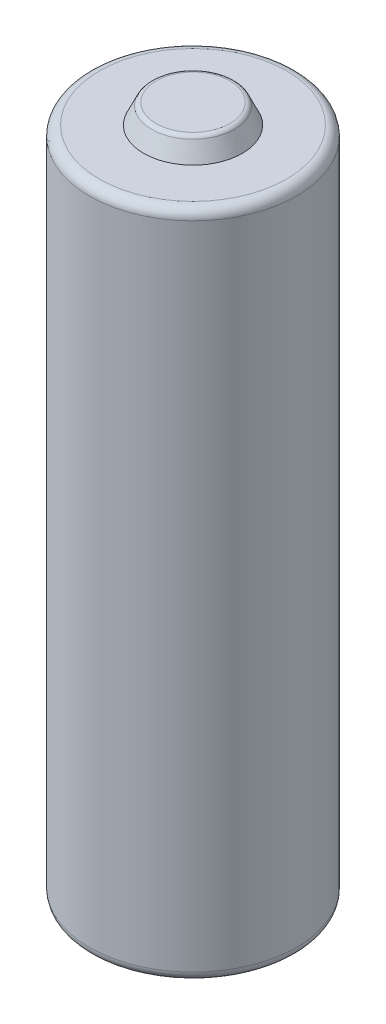
ISO-10303-21;
HEADER;
FILE_DESCRIPTION(('STEP AP214'),'2;1');
FILE_NAME('part.step','',(''),(''),'','','');
FILE_SCHEMA(('AUTOMOTIVE_DESIGN { 1 0 10303 214 1 1 1 1 }'));
ENDSEC;
DATA;
#1=APPLICATION_CONTEXT('core data for automotive mechanical design processes');
#2=APPLICATION_PROTOCOL_DEFINITION('international standard','automotive_design',2000,#1);
#3=PRODUCT_CONTEXT('',#1,'mechanical');
#4=PRODUCT('Part','Part','',(#3));
#5=PRODUCT_RELATED_PRODUCT_CATEGORY('part','',(#4));
#6=PRODUCT_DEFINITION_FORMATION('','',#4);
#7=PRODUCT_DEFINITION_CONTEXT('part definition',#1,'design');
#8=PRODUCT_DEFINITION('design','',#6,#7);
#9=PRODUCT_DEFINITION_SHAPE('','',#8);
#10=(LENGTH_UNIT() NAMED_UNIT(*) SI_UNIT(.MILLI.,.METRE.));
#11=(NAMED_UNIT(*) PLANE_ANGLE_UNIT() SI_UNIT($,.RADIAN.));
#12=(NAMED_UNIT(*) SI_UNIT($,.STERADIAN.) SOLID_ANGLE_UNIT());
#13=UNCERTAINTY_MEASURE_WITH_UNIT(LENGTH_MEASURE(1.E-05),#10,'distance_accuracy_value','');
#14=(GEOMETRIC_REPRESENTATION_CONTEXT(3) GLOBAL_UNCERTAINTY_ASSIGNED_CONTEXT((#13)) GLOBAL_UNIT_ASSIGNED_CONTEXT((#10,
#11,#12)) REPRESENTATION_CONTEXT('',''));
#15=CARTESIAN_POINT('',(0.,0.,0.));
#16=DIRECTION('',(0.,0.,1.));
#17=DIRECTION('',(1.,0.,0.));
#18=AXIS2_PLACEMENT_3D('',#15,#16,#17);
#19=CARTESIAN_POINT('',(0.,68.,0.));
#20=DIRECTION('',(0.,-1.,0.));
#21=DIRECTION('',(0.,0.,-1.));
#22=AXIS2_PLACEMENT_3D('',#19,#20,#21);
#23=CYLINDRICAL_SURFACE('',#22,10.5);
#24=CARTESIAN_POINT('',(0.,1.,0.));
#25=DIRECTION('',(0.,1.,0.));
#26=DIRECTION('',(0.,0.,1.));
#27=AXIS2_PLACEMENT_3D('',#24,#25,#26);
#28=CIRCLE('',#27,10.5);
#29=CARTESIAN_POINT('',(0.,1.,10.5));
#30=VERTEX_POINT('',#29);
#31=EDGE_CURVE('E55',#30,#30,#28,.T.);
#32=ORIENTED_EDGE('',*,*,#31,.T.);
#33=EDGE_LOOP('',(#32));
#34=FACE_BOUND('',#33,.T.);
#35=CARTESIAN_POINT('',(0.,67.,0.));
#36=DIRECTION('',(0.,1.,0.));
#37=DIRECTION('',(0.,0.,1.));
#38=AXIS2_PLACEMENT_3D('',#35,#36,#37);
#39=CIRCLE('',#38,10.5);
#40=CARTESIAN_POINT('',(0.,67.,10.5));
#41=VERTEX_POINT('',#40);
#42=EDGE_CURVE('E63',#41,#41,#39,.F.);
#43=ORIENTED_EDGE('',*,*,#42,.T.);
#44=EDGE_LOOP('',(#43));
#45=FACE_BOUND('',#44,.T.);
#46=ADVANCED_FACE('F44',(#34,#45),#23,.T.);
#47=CARTESIAN_POINT('',(0.,68.,0.));
#48=DIRECTION('',(0.,1.,0.));
#49=DIRECTION('',(0.,0.,1.));
#50=AXIS2_PLACEMENT_3D('',#47,#48,#49);
#51=PLANE('',#50);
#52=CARTESIAN_POINT('',(0.,68.,0.));
#53=DIRECTION('',(0.,1.,0.));
#54=DIRECTION('',(0.,0.,1.));
#55=AXIS2_PLACEMENT_3D('',#52,#53,#54);
#56=CIRCLE('',#55,9.5);
#57=CARTESIAN_POINT('',(0.,68.,9.5));
#58=VERTEX_POINT('',#57);
#59=EDGE_CURVE('E69',#58,#58,#56,.T.);
#60=ORIENTED_EDGE('',*,*,#59,.T.);
#61=EDGE_LOOP('',(#60));
#62=FACE_BOUND('',#61,.T.);
#63=CARTESIAN_POINT('',(0.,68.,0.));
#64=DIRECTION('',(0.,1.,0.));
#65=DIRECTION('',(0.,0.,1.));
#66=AXIS2_PLACEMENT_3D('',#63,#64,#65);
#67=CIRCLE('',#66,4.99738728551368);
#68=CARTESIAN_POINT('',(0.,68.,4.99738728551368));
#69=VERTEX_POINT('',#68);
#70=EDGE_CURVE('E72',#69,#69,#67,.T.);
#71=ORIENTED_EDGE('',*,*,#70,.F.);
#72=EDGE_LOOP('',(#71));
#73=FACE_BOUND('',#72,.T.);
#74=ADVANCED_FACE('F105',(#62,#73),#51,.T.);
#75=CARTESIAN_POINT('',(0.,0.,0.));
#76=DIRECTION('',(0.,1.,0.));
#77=DIRECTION('',(0.,0.,1.));
#78=AXIS2_PLACEMENT_3D('',#75,#76,#77);
#79=PLANE('',#78);
#80=CARTESIAN_POINT('',(0.,0.,0.));
#81=DIRECTION('',(0.,1.,0.));
#82=DIRECTION('',(0.,0.,1.));
#83=AXIS2_PLACEMENT_3D('',#80,#81,#82);
#84=CIRCLE('',#83,9.5);
#85=CARTESIAN_POINT('',(0.,0.,9.5));
#86=VERTEX_POINT('',#85);
#87=EDGE_CURVE('E10',#86,#86,#84,.F.);
#88=ORIENTED_EDGE('',*,*,#87,.T.);
#89=EDGE_LOOP('',(#88));
#90=FACE_BOUND('',#89,.T.);
#91=CARTESIAN_POINT('',(0.,0.,0.));
#92=DIRECTION('',(0.,-1.,0.));
#93=DIRECTION('',(0.,0.,-1.));
#94=AXIS2_PLACEMENT_3D('',#91,#92,#93);
#95=CIRCLE('',#94,7.00167494009295);
#96=CARTESIAN_POINT('',(0.,0.,-7.00167494009295));
#97=VERTEX_POINT('',#96);
#98=EDGE_CURVE('E80',#97,#97,#95,.T.);
#99=ORIENTED_EDGE('',*,*,#98,.F.);
#100=EDGE_LOOP('',(#99));
#101=FACE_BOUND('',#100,.T.);
#102=ADVANCED_FACE('F97',(#90,#101),#79,.F.);
#103=CARTESIAN_POINT('',(0.,68.,0.));
#104=DIRECTION('',(0.,-1.,0.));
#105=DIRECTION('',(0.,0.,1.));
#106=AXIS2_PLACEMENT_3D('',#103,#104,#105);
#107=CONICAL_SURFACE('',#106,4.99738728551368,0.436332312998583);
#108=CARTESIAN_POINT('',(0.,69.7113091308704,0.));
#109=DIRECTION('',(0.,-1.,0.));
#110=DIRECTION('',(0.,0.,-1.));
#111=AXIS2_PLACEMENT_3D('',#108,#109,#110);
#112=CIRCLE('',#111,4.19939073231826);
#113=CARTESIAN_POINT('',(0.,69.7113091308704,-4.19939073231826));
#114=VERTEX_POINT('',#113);
#115=EDGE_CURVE('E57',#114,#114,#112,.T.);
#116=ORIENTED_EDGE('',*,*,#115,.T.);
#117=EDGE_LOOP('',(#116));
#118=FACE_BOUND('',#117,.T.);
#119=ORIENTED_EDGE('',*,*,#70,.T.);
#120=EDGE_LOOP('',(#119));
#121=FACE_BOUND('',#120,.T.);
#122=ADVANCED_FACE('F127',(#118,#121),#107,.T.);
#123=CARTESIAN_POINT('',(0.,70.,0.));
#124=DIRECTION('',(0.,1.,0.));
#125=DIRECTION('',(0.,0.,1.));
#126=AXIS2_PLACEMENT_3D('',#123,#124,#125);
#127=PLANE('',#126);
#128=CARTESIAN_POINT('',(0.,70.,0.));
#129=DIRECTION('',(0.,1.,0.));
#130=DIRECTION('',(0.,0.,1.));
#131=AXIS2_PLACEMENT_3D('',#128,#129,#130);
#132=CIRCLE('',#131,3.74623683879993);
#133=CARTESIAN_POINT('',(0.,70.,3.74623683879993));
#134=VERTEX_POINT('',#133);
#135=EDGE_CURVE('E58',#134,#134,#132,.T.);
#136=ORIENTED_EDGE('',*,*,#135,.T.);
#137=EDGE_LOOP('',(#136));
#138=FACE_BOUND('',#137,.T.);
#139=ADVANCED_FACE('F96',(#138),#127,.T.);
#140=CARTESIAN_POINT('',(0.,0.,0.));
#141=DIRECTION('',(0.,-1.,0.));
#142=DIRECTION('',(0.,0.,-1.));
#143=AXIS2_PLACEMENT_3D('',#140,#141,#142);
#144=CONICAL_SURFACE('',#143,7.00167494009295,0.436332312998583);
#145=ORIENTED_EDGE('',*,*,#98,.T.);
#146=EDGE_LOOP('',(#145));
#147=FACE_BOUND('',#146,.T.);
#148=CARTESIAN_POINT('',(0.,1.06929569915336,0.));
#149=DIRECTION('',(0.,-1.,0.));
#150=DIRECTION('',(0.,0.,-1.));
#151=AXIS2_PLACEMENT_3D('',#148,#149,#150);
#152=CIRCLE('',#151,6.50305416674554);
#153=CARTESIAN_POINT('',(0.,1.06929569915336,-6.50305416674554));
#154=VERTEX_POINT('',#153);
#155=EDGE_CURVE('E71',#154,#154,#152,.T.);
#156=ORIENTED_EDGE('',*,*,#155,.F.);
#157=EDGE_LOOP('',(#156));
#158=FACE_BOUND('',#157,.T.);
#159=ADVANCED_FACE('F89',(#147,#158),#144,.F.);
#160=CARTESIAN_POINT('',(0.,0.,0.));
#161=DIRECTION('',(0.,1.,0.));
#162=DIRECTION('',(0.,0.,-1.));
#163=AXIS2_PLACEMENT_3D('',#160,#161,#162);
#164=CONICAL_SURFACE('',#163,6.00443339339812,0.436332312998583);
#165=ORIENTED_EDGE('',*,*,#155,.T.);
#166=EDGE_LOOP('',(#165));
#167=FACE_BOUND('',#166,.T.);
#168=CARTESIAN_POINT('',(0.,0.,0.));
#169=DIRECTION('',(0.,-1.,0.));
#170=DIRECTION('',(0.,0.,-1.));
#171=AXIS2_PLACEMENT_3D('',#168,#169,#170);
#172=CIRCLE('',#171,6.00443339339812);
#173=CARTESIAN_POINT('',(0.,0.,-6.00443339339812));
#174=VERTEX_POINT('',#173);
#175=EDGE_CURVE('E78',#174,#174,#172,.T.);
#176=ORIENTED_EDGE('',*,*,#175,.F.);
#177=EDGE_LOOP('',(#176));
#178=FACE_BOUND('',#177,.T.);
#179=ADVANCED_FACE('F87',(#167,#178),#164,.T.);
#180=ORIENTED_EDGE('',*,*,#175,.T.);
#181=EDGE_LOOP('',(#180));
#182=FACE_BOUND('',#181,.T.);
#183=ADVANCED_FACE('F81',(#182),#79,.F.);
#184=CARTESIAN_POINT('',(0.,67.,0.));
#185=DIRECTION('',(0.,1.,0.));
#186=DIRECTION('',(0.,0.,1.));
#187=AXIS2_PLACEMENT_3D('',#184,#185,#186);
#188=TOROIDAL_SURFACE('',#187,9.5,1.);
#189=ORIENTED_EDGE('',*,*,#42,.F.);
#190=EDGE_LOOP('',(#189));
#191=FACE_BOUND('',#190,.T.);
#192=ORIENTED_EDGE('',*,*,#59,.F.);
#193=EDGE_LOOP('',(#192));
#194=FACE_BOUND('',#193,.T.);
#195=ADVANCED_FACE('F93',(#191,#194),#188,.T.);
#196=CARTESIAN_POINT('',(0.,69.5,0.));
#197=DIRECTION('',(0.,1.,0.));
#198=DIRECTION('',(0.,0.,1.));
#199=AXIS2_PLACEMENT_3D('',#196,#197,#198);
#200=TOROIDAL_SURFACE('',#199,3.74623683879993,0.5);
#201=ORIENTED_EDGE('',*,*,#115,.F.);
#202=EDGE_LOOP('',(#201));
#203=FACE_BOUND('',#202,.T.);
#204=ORIENTED_EDGE('',*,*,#135,.F.);
#205=EDGE_LOOP('',(#204));
#206=FACE_BOUND('',#205,.T.);
#207=ADVANCED_FACE('F115',(#203,#206),#200,.T.);
#208=CARTESIAN_POINT('',(0.,1.,0.));
#209=DIRECTION('',(0.,1.,0.));
#210=DIRECTION('',(0.,0.,1.));
#211=AXIS2_PLACEMENT_3D('',#208,#209,#210);
#212=TOROIDAL_SURFACE('',#211,9.5,1.);
#213=ORIENTED_EDGE('',*,*,#87,.F.);
#214=EDGE_LOOP('',(#213));
#215=FACE_BOUND('',#214,.T.);
#216=ORIENTED_EDGE('',*,*,#31,.F.);
#217=EDGE_LOOP('',(#216));
#218=FACE_BOUND('',#217,.T.);
#219=ADVANCED_FACE('F50',(#215,#218),#212,.T.);
#220=CLOSED_SHELL('',(#46,#74,#102,#122,#139,#159,#179,#183,#195,#207,#219));
#221=MANIFOLD_SOLID_BREP('B2',#220);
#222=ADVANCED_BREP_SHAPE_REPRESENTATION('',(#18,#221),#14);
#223=SHAPE_DEFINITION_REPRESENTATION(#9,#222);
ENDSEC;
END-ISO-10303-21;
